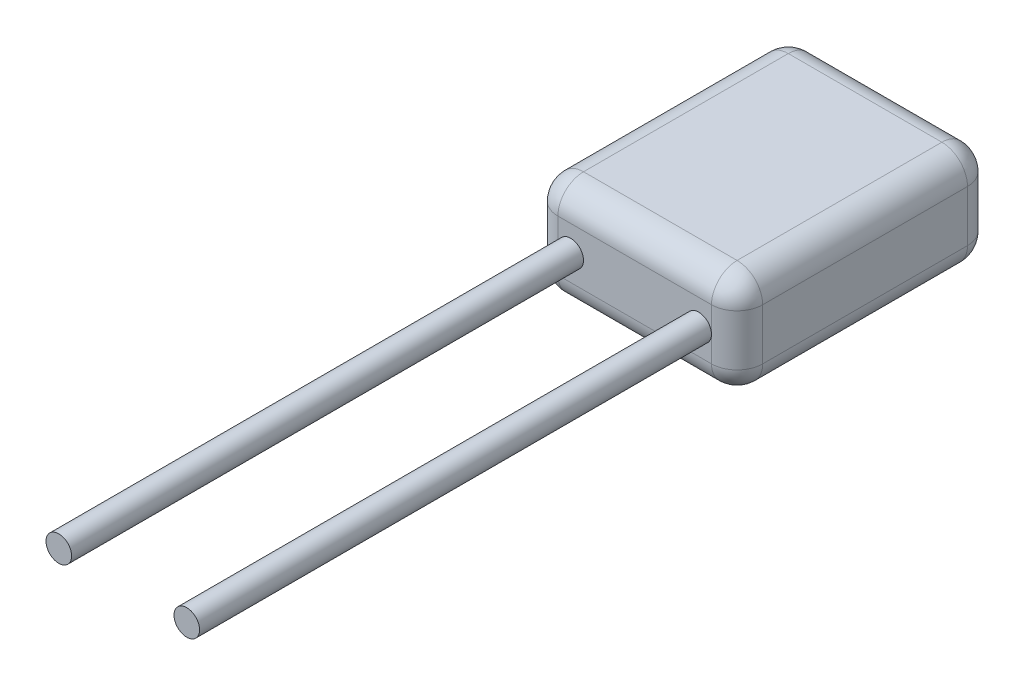
ISO-10303-21;
HEADER;
FILE_DESCRIPTION(('STEP AP214'),'2;1');
FILE_NAME('part.step','',(''),(''),'','','');
FILE_SCHEMA(('AUTOMOTIVE_DESIGN { 1 0 10303 214 1 1 1 1 }'));
ENDSEC;
DATA;
#1=APPLICATION_CONTEXT('core data for automotive mechanical design processes');
#2=APPLICATION_PROTOCOL_DEFINITION('international standard','automotive_design',2000,#1);
#3=PRODUCT_CONTEXT('',#1,'mechanical');
#4=PRODUCT('Part','Part','',(#3));
#5=PRODUCT_RELATED_PRODUCT_CATEGORY('part','',(#4));
#6=PRODUCT_DEFINITION_FORMATION('','',#4);
#7=PRODUCT_DEFINITION_CONTEXT('part definition',#1,'design');
#8=PRODUCT_DEFINITION('design','',#6,#7);
#9=PRODUCT_DEFINITION_SHAPE('','',#8);
#10=(LENGTH_UNIT() NAMED_UNIT(*) SI_UNIT(.MILLI.,.METRE.));
#11=(NAMED_UNIT(*) PLANE_ANGLE_UNIT() SI_UNIT($,.RADIAN.));
#12=(NAMED_UNIT(*) SI_UNIT($,.STERADIAN.) SOLID_ANGLE_UNIT());
#13=UNCERTAINTY_MEASURE_WITH_UNIT(LENGTH_MEASURE(1.E-05),#10,'distance_accuracy_value','');
#14=(GEOMETRIC_REPRESENTATION_CONTEXT(3) GLOBAL_UNCERTAINTY_ASSIGNED_CONTEXT((#13)) GLOBAL_UNIT_ASSIGNED_CONTEXT((#10,
#11,#12)) REPRESENTATION_CONTEXT('',''));
#15=CARTESIAN_POINT('',(0.,0.,0.));
#16=DIRECTION('',(0.,0.,1.));
#17=DIRECTION('',(1.,0.,0.));
#18=AXIS2_PLACEMENT_3D('',#15,#16,#17);
#19=CARTESIAN_POINT('',(2.,-1.,5.));
#20=DIRECTION('',(-1.,0.,0.));
#21=DIRECTION('',(0.,0.,1.));
#22=AXIS2_PLACEMENT_3D('',#19,#20,#21);
#23=PLANE('',#22);
#24=DIRECTION('',(0.,0.,-1.));
#25=VECTOR('',#24,1.);
#26=CARTESIAN_POINT('',(2.,0.5,5.));
#27=LINE('',#26,#25);
#28=CARTESIAN_POINT('',(2.,0.5,0.5));
#29=VERTEX_POINT('',#28);
#30=CARTESIAN_POINT('',(2.,0.5,4.5));
#31=VERTEX_POINT('',#30);
#32=EDGE_CURVE('E167',#29,#31,#27,.F.);
#33=ORIENTED_EDGE('',*,*,#32,.T.);
#34=DIRECTION('',(0.,1.,0.));
#35=VECTOR('',#34,1.);
#36=CARTESIAN_POINT('',(2.,-1.,4.5));
#37=LINE('',#36,#35);
#38=CARTESIAN_POINT('',(2.,-0.5,4.5));
#39=VERTEX_POINT('',#38);
#40=EDGE_CURVE('E171',#31,#39,#37,.F.);
#41=ORIENTED_EDGE('',*,*,#40,.T.);
#42=DIRECTION('',(0.,0.,-1.));
#43=VECTOR('',#42,1.);
#44=CARTESIAN_POINT('',(2.,-0.5,5.));
#45=LINE('',#44,#43);
#46=CARTESIAN_POINT('',(2.,-0.5,0.5));
#47=VERTEX_POINT('',#46);
#48=EDGE_CURVE('E169',#39,#47,#45,.T.);
#49=ORIENTED_EDGE('',*,*,#48,.T.);
#50=DIRECTION('',(0.,1.,0.));
#51=VECTOR('',#50,1.);
#52=CARTESIAN_POINT('',(2.,1.,0.5));
#53=LINE('',#52,#51);
#54=EDGE_CURVE('E165',#47,#29,#53,.T.);
#55=ORIENTED_EDGE('',*,*,#54,.T.);
#56=EDGE_LOOP('',(#33,#41,#49,#55));
#57=FACE_BOUND('',#56,.T.);
#58=ADVANCED_FACE('F36',(#57),#23,.F.);
#59=CARTESIAN_POINT('',(-2.,1.,5.));
#60=DIRECTION('',(0.,-1.,0.));
#61=DIRECTION('',(0.,0.,-1.));
#62=AXIS2_PLACEMENT_3D('',#59,#60,#61);
#63=PLANE('',#62);
#64=DIRECTION('',(-1.,0.,0.));
#65=VECTOR('',#64,1.);
#66=CARTESIAN_POINT('',(-2.,1.,4.5));
#67=LINE('',#66,#65);
#68=CARTESIAN_POINT('',(-1.5,1.,4.5));
#69=VERTEX_POINT('',#68);
#70=CARTESIAN_POINT('',(1.5,1.,4.5));
#71=VERTEX_POINT('',#70);
#72=EDGE_CURVE('E196',#69,#71,#67,.F.);
#73=ORIENTED_EDGE('',*,*,#72,.T.);
#74=DIRECTION('',(0.,0.,-1.));
#75=VECTOR('',#74,1.);
#76=CARTESIAN_POINT('',(1.5,1.,5.));
#77=LINE('',#76,#75);
#78=CARTESIAN_POINT('',(1.5,1.,0.5));
#79=VERTEX_POINT('',#78);
#80=EDGE_CURVE('E198',#71,#79,#77,.T.);
#81=ORIENTED_EDGE('',*,*,#80,.T.);
#82=DIRECTION('',(-1.,0.,0.));
#83=VECTOR('',#82,1.);
#84=CARTESIAN_POINT('',(-2.,1.,0.5));
#85=LINE('',#84,#83);
#86=CARTESIAN_POINT('',(-1.5,1.,0.5));
#87=VERTEX_POINT('',#86);
#88=EDGE_CURVE('E192',#79,#87,#85,.T.);
#89=ORIENTED_EDGE('',*,*,#88,.T.);
#90=DIRECTION('',(0.,0.,-1.));
#91=VECTOR('',#90,1.);
#92=CARTESIAN_POINT('',(-1.5,1.,5.));
#93=LINE('',#92,#91);
#94=EDGE_CURVE('E194',#87,#69,#93,.F.);
#95=ORIENTED_EDGE('',*,*,#94,.T.);
#96=EDGE_LOOP('',(#73,#81,#89,#95));
#97=FACE_BOUND('',#96,.T.);
#98=ADVANCED_FACE('F360',(#97),#63,.F.);
#99=CARTESIAN_POINT('',(-2.,-1.,5.));
#100=DIRECTION('',(1.,0.,0.));
#101=DIRECTION('',(0.,0.,-1.));
#102=AXIS2_PLACEMENT_3D('',#99,#100,#101);
#103=PLANE('',#102);
#104=DIRECTION('',(0.,0.,-1.));
#105=VECTOR('',#104,1.);
#106=CARTESIAN_POINT('',(-2.,-0.5,5.));
#107=LINE('',#106,#105);
#108=CARTESIAN_POINT('',(-2.,-0.5,0.5));
#109=VERTEX_POINT('',#108);
#110=CARTESIAN_POINT('',(-2.,-0.5,4.5));
#111=VERTEX_POINT('',#110);
#112=EDGE_CURVE('E178',#109,#111,#107,.F.);
#113=ORIENTED_EDGE('',*,*,#112,.T.);
#114=DIRECTION('',(0.,-1.,0.));
#115=VECTOR('',#114,1.);
#116=CARTESIAN_POINT('',(-2.,-1.,4.5));
#117=LINE('',#116,#115);
#118=CARTESIAN_POINT('',(-2.,0.5,4.5));
#119=VERTEX_POINT('',#118);
#120=EDGE_CURVE('E180',#111,#119,#117,.F.);
#121=ORIENTED_EDGE('',*,*,#120,.T.);
#122=DIRECTION('',(0.,0.,-1.));
#123=VECTOR('',#122,1.);
#124=CARTESIAN_POINT('',(-2.,0.5,5.));
#125=LINE('',#124,#123);
#126=CARTESIAN_POINT('',(-2.,0.5,0.5));
#127=VERTEX_POINT('',#126);
#128=EDGE_CURVE('E176',#119,#127,#125,.T.);
#129=ORIENTED_EDGE('',*,*,#128,.T.);
#130=DIRECTION('',(0.,-1.,0.));
#131=VECTOR('',#130,1.);
#132=CARTESIAN_POINT('',(-2.,-1.,0.5));
#133=LINE('',#132,#131);
#134=EDGE_CURVE('E174',#127,#109,#133,.T.);
#135=ORIENTED_EDGE('',*,*,#134,.T.);
#136=EDGE_LOOP('',(#113,#121,#129,#135));
#137=FACE_BOUND('',#136,.T.);
#138=ADVANCED_FACE('F326',(#137),#103,.F.);
#139=CARTESIAN_POINT('',(-2.,-1.,5.));
#140=DIRECTION('',(0.,1.,0.));
#141=DIRECTION('',(0.,0.,1.));
#142=AXIS2_PLACEMENT_3D('',#139,#140,#141);
#143=PLANE('',#142);
#144=DIRECTION('',(1.,0.,0.));
#145=VECTOR('',#144,1.);
#146=CARTESIAN_POINT('',(-2.,-1.,4.5));
#147=LINE('',#146,#145);
#148=CARTESIAN_POINT('',(1.5,-1.,4.5));
#149=VERTEX_POINT('',#148);
#150=CARTESIAN_POINT('',(-1.5,-1.,4.5));
#151=VERTEX_POINT('',#150);
#152=EDGE_CURVE('E187',#149,#151,#147,.F.);
#153=ORIENTED_EDGE('',*,*,#152,.T.);
#154=DIRECTION('',(0.,0.,-1.));
#155=VECTOR('',#154,1.);
#156=CARTESIAN_POINT('',(-1.5,-1.,5.));
#157=LINE('',#156,#155);
#158=CARTESIAN_POINT('',(-1.5,-1.,0.5));
#159=VERTEX_POINT('',#158);
#160=EDGE_CURVE('E189',#151,#159,#157,.T.);
#161=ORIENTED_EDGE('',*,*,#160,.T.);
#162=DIRECTION('',(1.,0.,0.));
#163=VECTOR('',#162,1.);
#164=CARTESIAN_POINT('',(2.,-1.,0.5));
#165=LINE('',#164,#163);
#166=CARTESIAN_POINT('',(1.5,-1.,0.5));
#167=VERTEX_POINT('',#166);
#168=EDGE_CURVE('E183',#159,#167,#165,.T.);
#169=ORIENTED_EDGE('',*,*,#168,.T.);
#170=DIRECTION('',(0.,0.,-1.));
#171=VECTOR('',#170,1.);
#172=CARTESIAN_POINT('',(1.5,-1.,5.));
#173=LINE('',#172,#171);
#174=EDGE_CURVE('E185',#167,#149,#173,.F.);
#175=ORIENTED_EDGE('',*,*,#174,.T.);
#176=EDGE_LOOP('',(#153,#161,#169,#175));
#177=FACE_BOUND('',#176,.T.);
#178=ADVANCED_FACE('F332',(#177),#143,.F.);
#179=CARTESIAN_POINT('',(0.,0.,5.));
#180=DIRECTION('',(0.,0.,-1.));
#181=DIRECTION('',(-1.,0.,0.));
#182=AXIS2_PLACEMENT_3D('',#179,#180,#181);
#183=PLANE('',#182);
#184=CARTESIAN_POINT('',(-1.25,0.,5.));
#185=DIRECTION('',(0.,0.,-1.));
#186=DIRECTION('',(-1.,0.,0.));
#187=AXIS2_PLACEMENT_3D('',#184,#185,#186);
#188=CIRCLE('',#187,0.25);
#189=CARTESIAN_POINT('',(-1.5,0.,5.));
#190=VERTEX_POINT('',#189);
#191=EDGE_CURVE('E153',#190,#190,#188,.F.);
#192=ORIENTED_EDGE('',*,*,#191,.F.);
#193=DIRECTION('',(0.,-1.,0.));
#194=VECTOR('',#193,1.);
#195=CARTESIAN_POINT('',(-1.5,0.,5.));
#196=LINE('',#195,#194);
#197=CARTESIAN_POINT('',(-1.5,-0.5,5.));
#198=VERTEX_POINT('',#197);
#199=EDGE_CURVE('E163',#190,#198,#196,.T.);
#200=ORIENTED_EDGE('',*,*,#199,.T.);
#201=DIRECTION('',(1.,0.,0.));
#202=VECTOR('',#201,1.);
#203=CARTESIAN_POINT('',(0.,-0.5,5.));
#204=LINE('',#203,#202);
#205=CARTESIAN_POINT('',(1.5,-0.5,5.));
#206=VERTEX_POINT('',#205);
#207=EDGE_CURVE('E147',#198,#206,#204,.T.);
#208=ORIENTED_EDGE('',*,*,#207,.T.);
#209=DIRECTION('',(0.,1.,0.));
#210=VECTOR('',#209,1.);
#211=CARTESIAN_POINT('',(1.5,0.,5.));
#212=LINE('',#211,#210);
#213=CARTESIAN_POINT('',(1.5,0.,5.));
#214=VERTEX_POINT('',#213);
#215=EDGE_CURVE('E133',#206,#214,#212,.T.);
#216=ORIENTED_EDGE('',*,*,#215,.T.);
#217=CARTESIAN_POINT('',(1.25,0.,5.));
#218=DIRECTION('',(0.,0.,-1.));
#219=DIRECTION('',(-1.,0.,0.));
#220=AXIS2_PLACEMENT_3D('',#217,#218,#219);
#221=CIRCLE('',#220,0.25);
#222=EDGE_CURVE('E145',#214,#214,#221,.F.);
#223=ORIENTED_EDGE('',*,*,#222,.F.);
#224=DIRECTION('',(0.,1.,0.));
#225=VECTOR('',#224,1.);
#226=CARTESIAN_POINT('',(1.5,0.,5.));
#227=LINE('',#226,#225);
#228=CARTESIAN_POINT('',(1.5,0.5,5.));
#229=VERTEX_POINT('',#228);
#230=EDGE_CURVE('E130',#214,#229,#227,.T.);
#231=ORIENTED_EDGE('',*,*,#230,.T.);
#232=DIRECTION('',(-1.,0.,0.));
#233=VECTOR('',#232,1.);
#234=CARTESIAN_POINT('',(0.,0.5,5.));
#235=LINE('',#234,#233);
#236=CARTESIAN_POINT('',(-1.5,0.5,5.));
#237=VERTEX_POINT('',#236);
#238=EDGE_CURVE('E152',#229,#237,#235,.T.);
#239=ORIENTED_EDGE('',*,*,#238,.T.);
#240=DIRECTION('',(0.,-1.,0.));
#241=VECTOR('',#240,1.);
#242=CARTESIAN_POINT('',(-1.5,0.,5.));
#243=LINE('',#242,#241);
#244=EDGE_CURVE('E140',#237,#190,#243,.T.);
#245=ORIENTED_EDGE('',*,*,#244,.T.);
#246=EDGE_LOOP('',(#192,#200,#208,#216,#223,#231,#239,#245));
#247=FACE_BOUND('',#246,.T.);
#248=ADVANCED_FACE('F144',(#247),#183,.F.);
#249=CARTESIAN_POINT('',(0.,0.,0.));
#250=DIRECTION('',(0.,0.,-1.));
#251=DIRECTION('',(-1.,0.,0.));
#252=AXIS2_PLACEMENT_3D('',#249,#250,#251);
#253=PLANE('',#252);
#254=DIRECTION('',(0.,-1.,0.));
#255=VECTOR('',#254,1.);
#256=CARTESIAN_POINT('',(-1.5,1.,0.));
#257=LINE('',#256,#255);
#258=CARTESIAN_POINT('',(-1.5,-0.5,0.));
#259=VERTEX_POINT('',#258);
#260=CARTESIAN_POINT('',(-1.5,0.5,0.));
#261=VERTEX_POINT('',#260);
#262=EDGE_CURVE('E45',#259,#261,#257,.F.);
#263=ORIENTED_EDGE('',*,*,#262,.T.);
#264=DIRECTION('',(-1.,0.,0.));
#265=VECTOR('',#264,1.);
#266=CARTESIAN_POINT('',(2.,0.5,0.));
#267=LINE('',#266,#265);
#268=CARTESIAN_POINT('',(1.5,0.5,0.));
#269=VERTEX_POINT('',#268);
#270=EDGE_CURVE('E11',#261,#269,#267,.F.);
#271=ORIENTED_EDGE('',*,*,#270,.T.);
#272=DIRECTION('',(0.,1.,0.));
#273=VECTOR('',#272,1.);
#274=CARTESIAN_POINT('',(1.5,-1.,0.));
#275=LINE('',#274,#273);
#276=CARTESIAN_POINT('',(1.5,-0.5,0.));
#277=VERTEX_POINT('',#276);
#278=EDGE_CURVE('E201',#269,#277,#275,.F.);
#279=ORIENTED_EDGE('',*,*,#278,.T.);
#280=DIRECTION('',(1.,0.,0.));
#281=VECTOR('',#280,1.);
#282=CARTESIAN_POINT('',(-2.,-0.5,0.));
#283=LINE('',#282,#281);
#284=EDGE_CURVE('E56',#277,#259,#283,.F.);
#285=ORIENTED_EDGE('',*,*,#284,.T.);
#286=EDGE_LOOP('',(#263,#271,#279,#285));
#287=FACE_BOUND('',#286,.T.);
#288=ADVANCED_FACE('F287',(#287),#253,.T.);
#289=CARTESIAN_POINT('',(-1.25,0.,15.));
#290=DIRECTION('',(0.,0.,-1.));
#291=DIRECTION('',(-1.,0.,0.));
#292=AXIS2_PLACEMENT_3D('',#289,#290,#291);
#293=CYLINDRICAL_SURFACE('',#292,0.25);
#294=CARTESIAN_POINT('',(-1.25,0.,15.));
#295=DIRECTION('',(0.,0.,1.));
#296=DIRECTION('',(1.,0.,0.));
#297=AXIS2_PLACEMENT_3D('',#294,#295,#296);
#298=CIRCLE('',#297,0.25);
#299=CARTESIAN_POINT('',(-1.,0.,15.));
#300=VERTEX_POINT('',#299);
#301=EDGE_CURVE('E157',#300,#300,#298,.T.);
#302=ORIENTED_EDGE('',*,*,#301,.F.);
#303=EDGE_LOOP('',(#302));
#304=FACE_BOUND('',#303,.T.);
#305=ORIENTED_EDGE('',*,*,#191,.T.);
#306=EDGE_LOOP('',(#305));
#307=FACE_BOUND('',#306,.T.);
#308=ADVANCED_FACE('F284',(#304,#307),#293,.T.);
#309=CARTESIAN_POINT('',(0.,0.,15.));
#310=DIRECTION('',(0.,0.,1.));
#311=DIRECTION('',(1.,0.,0.));
#312=AXIS2_PLACEMENT_3D('',#309,#310,#311);
#313=PLANE('',#312);
#314=ORIENTED_EDGE('',*,*,#301,.T.);
#315=EDGE_LOOP('',(#314));
#316=FACE_BOUND('',#315,.T.);
#317=ADVANCED_FACE('F282',(#316),#313,.T.);
#318=CARTESIAN_POINT('',(1.25,0.,15.));
#319=DIRECTION('',(0.,0.,-1.));
#320=DIRECTION('',(-1.,0.,0.));
#321=AXIS2_PLACEMENT_3D('',#318,#319,#320);
#322=CYLINDRICAL_SURFACE('',#321,0.25);
#323=CARTESIAN_POINT('',(1.25,0.,15.));
#324=DIRECTION('',(0.,0.,1.));
#325=DIRECTION('',(1.,0.,0.));
#326=AXIS2_PLACEMENT_3D('',#323,#324,#325);
#327=CIRCLE('',#326,0.25);
#328=CARTESIAN_POINT('',(1.5,0.,15.));
#329=VERTEX_POINT('',#328);
#330=EDGE_CURVE('E270',#329,#329,#327,.T.);
#331=ORIENTED_EDGE('',*,*,#330,.F.);
#332=EDGE_LOOP('',(#331));
#333=FACE_BOUND('',#332,.T.);
#334=ORIENTED_EDGE('',*,*,#222,.T.);
#335=EDGE_LOOP('',(#334));
#336=FACE_BOUND('',#335,.T.);
#337=ADVANCED_FACE('F151',(#333,#336),#322,.T.);
#338=CARTESIAN_POINT('',(0.,0.,15.));
#339=DIRECTION('',(0.,0.,1.));
#340=DIRECTION('',(1.,0.,0.));
#341=AXIS2_PLACEMENT_3D('',#338,#339,#340);
#342=PLANE('',#341);
#343=ORIENTED_EDGE('',*,*,#330,.T.);
#344=EDGE_LOOP('',(#343));
#345=FACE_BOUND('',#344,.T.);
#346=ADVANCED_FACE('F357',(#345),#342,.T.);
#347=CARTESIAN_POINT('',(-1.5,-1.,0.5));
#348=DIRECTION('',(0.,1.,0.));
#349=DIRECTION('',(0.,0.,1.));
#350=AXIS2_PLACEMENT_3D('',#347,#348,#349);
#351=CYLINDRICAL_SURFACE('',#350,0.5);
#352=CARTESIAN_POINT('',(-1.5,-0.5,0.5));
#353=DIRECTION('',(0.,-1.,0.));
#354=DIRECTION('',(0.,0.,-1.));
#355=AXIS2_PLACEMENT_3D('',#352,#353,#354);
#356=CIRCLE('',#355,0.5);
#357=EDGE_CURVE('E40',#109,#259,#356,.T.);
#358=ORIENTED_EDGE('',*,*,#357,.F.);
#359=ORIENTED_EDGE('',*,*,#134,.F.);
#360=CARTESIAN_POINT('',(-1.5,0.5,0.5));
#361=DIRECTION('',(0.,1.,0.));
#362=DIRECTION('',(0.,0.,1.));
#363=AXIS2_PLACEMENT_3D('',#360,#361,#362);
#364=CIRCLE('',#363,0.5);
#365=EDGE_CURVE('E264',#261,#127,#364,.T.);
#366=ORIENTED_EDGE('',*,*,#365,.F.);
#367=ORIENTED_EDGE('',*,*,#262,.F.);
#368=EDGE_LOOP('',(#358,#359,#366,#367));
#369=FACE_BOUND('',#368,.T.);
#370=ADVANCED_FACE('F38',(#369),#351,.T.);
#371=CARTESIAN_POINT('',(-1.5,-0.5,0.5));
#372=DIRECTION('',(0.,0.,1.));
#373=DIRECTION('',(1.,0.,0.));
#374=AXIS2_PLACEMENT_3D('',#371,#372,#373);
#375=SPHERICAL_SURFACE('',#374,0.5);
#376=CARTESIAN_POINT('',(-1.5,-0.5,0.5));
#377=DIRECTION('',(0.,0.,-1.));
#378=DIRECTION('',(-1.,0.,0.));
#379=AXIS2_PLACEMENT_3D('',#376,#377,#378);
#380=CIRCLE('',#379,0.5);
#381=EDGE_CURVE('E259',#109,#159,#380,.F.);
#382=ORIENTED_EDGE('',*,*,#381,.F.);
#383=ORIENTED_EDGE('',*,*,#357,.T.);
#384=CARTESIAN_POINT('',(-1.5,-0.5,0.5));
#385=DIRECTION('',(-1.,0.,0.));
#386=DIRECTION('',(0.,0.,1.));
#387=AXIS2_PLACEMENT_3D('',#384,#385,#386);
#388=CIRCLE('',#387,0.5);
#389=EDGE_CURVE('E262',#159,#259,#388,.F.);
#390=ORIENTED_EDGE('',*,*,#389,.F.);
#391=EDGE_LOOP('',(#382,#383,#390));
#392=FACE_BOUND('',#391,.T.);
#393=ADVANCED_FACE('F349',(#392),#375,.T.);
#394=CARTESIAN_POINT('',(-1.5,0.5,0.5));
#395=DIRECTION('',(0.,0.,1.));
#396=DIRECTION('',(1.,0.,0.));
#397=AXIS2_PLACEMENT_3D('',#394,#395,#396);
#398=SPHERICAL_SURFACE('',#397,0.5);
#399=CARTESIAN_POINT('',(-1.5,0.5,0.5));
#400=DIRECTION('',(-1.,0.,0.));
#401=DIRECTION('',(0.,0.,1.));
#402=AXIS2_PLACEMENT_3D('',#399,#400,#401);
#403=CIRCLE('',#402,0.5);
#404=EDGE_CURVE('E253',#261,#87,#403,.F.);
#405=ORIENTED_EDGE('',*,*,#404,.F.);
#406=ORIENTED_EDGE('',*,*,#365,.T.);
#407=CARTESIAN_POINT('',(-1.5,0.5,0.5));
#408=DIRECTION('',(0.,0.,-1.));
#409=DIRECTION('',(-1.,0.,0.));
#410=AXIS2_PLACEMENT_3D('',#407,#408,#409);
#411=CIRCLE('',#410,0.5);
#412=EDGE_CURVE('E256',#87,#127,#411,.F.);
#413=ORIENTED_EDGE('',*,*,#412,.F.);
#414=EDGE_LOOP('',(#405,#406,#413));
#415=FACE_BOUND('',#414,.T.);
#416=ADVANCED_FACE('F351',(#415),#398,.T.);
#417=CARTESIAN_POINT('',(-2.,-0.5,0.5));
#418=DIRECTION('',(-1.,0.,0.));
#419=DIRECTION('',(0.,0.,1.));
#420=AXIS2_PLACEMENT_3D('',#417,#418,#419);
#421=CYLINDRICAL_SURFACE('',#420,0.5);
#422=ORIENTED_EDGE('',*,*,#389,.T.);
#423=ORIENTED_EDGE('',*,*,#284,.F.);
#424=CARTESIAN_POINT('',(1.5,-0.5,0.5));
#425=DIRECTION('',(1.,0.,0.));
#426=DIRECTION('',(0.,0.,-1.));
#427=AXIS2_PLACEMENT_3D('',#424,#425,#426);
#428=CIRCLE('',#427,0.5);
#429=EDGE_CURVE('E247',#167,#277,#428,.T.);
#430=ORIENTED_EDGE('',*,*,#429,.F.);
#431=ORIENTED_EDGE('',*,*,#168,.F.);
#432=EDGE_LOOP('',(#422,#423,#430,#431));
#433=FACE_BOUND('',#432,.T.);
#434=ADVANCED_FACE('F348',(#433),#421,.T.);
#435=CARTESIAN_POINT('',(-1.5,-0.5,5.));
#436=DIRECTION('',(0.,0.,-1.));
#437=DIRECTION('',(-1.,0.,0.));
#438=AXIS2_PLACEMENT_3D('',#435,#436,#437);
#439=CYLINDRICAL_SURFACE('',#438,0.5);
#440=ORIENTED_EDGE('',*,*,#381,.T.);
#441=ORIENTED_EDGE('',*,*,#160,.F.);
#442=CARTESIAN_POINT('',(-1.5,-0.5,4.5));
#443=DIRECTION('',(0.,0.,1.));
#444=DIRECTION('',(1.,0.,0.));
#445=AXIS2_PLACEMENT_3D('',#442,#443,#444);
#446=CIRCLE('',#445,0.5);
#447=EDGE_CURVE('E244',#111,#151,#446,.T.);
#448=ORIENTED_EDGE('',*,*,#447,.F.);
#449=ORIENTED_EDGE('',*,*,#112,.F.);
#450=EDGE_LOOP('',(#440,#441,#448,#449));
#451=FACE_BOUND('',#450,.T.);
#452=ADVANCED_FACE('F329',(#451),#439,.T.);
#453=CARTESIAN_POINT('',(-1.5,0.,4.5));
#454=DIRECTION('',(0.,-1.,0.));
#455=DIRECTION('',(0.,0.,-1.));
#456=AXIS2_PLACEMENT_3D('',#453,#454,#455);
#457=CYLINDRICAL_SURFACE('',#456,0.5);
#458=CARTESIAN_POINT('',(-1.5,0.5,4.5));
#459=DIRECTION('',(0.,1.,0.));
#460=DIRECTION('',(0.,0.,1.));
#461=AXIS2_PLACEMENT_3D('',#458,#459,#460);
#462=CIRCLE('',#461,0.5);
#463=EDGE_CURVE('E238',#119,#237,#462,.T.);
#464=ORIENTED_EDGE('',*,*,#463,.F.);
#465=ORIENTED_EDGE('',*,*,#120,.F.);
#466=CARTESIAN_POINT('',(-1.5,-0.5,4.5));
#467=DIRECTION('',(0.,-1.,0.));
#468=DIRECTION('',(0.,0.,-1.));
#469=AXIS2_PLACEMENT_3D('',#466,#467,#468);
#470=CIRCLE('',#469,0.5);
#471=EDGE_CURVE('E241',#198,#111,#470,.T.);
#472=ORIENTED_EDGE('',*,*,#471,.F.);
#473=ORIENTED_EDGE('',*,*,#199,.F.);
#474=ORIENTED_EDGE('',*,*,#244,.F.);
#475=EDGE_LOOP('',(#464,#465,#472,#473,#474));
#476=FACE_BOUND('',#475,.T.);
#477=ADVANCED_FACE('F294',(#476),#457,.T.);
#478=CARTESIAN_POINT('',(-1.5,0.5,5.));
#479=DIRECTION('',(0.,0.,-1.));
#480=DIRECTION('',(-1.,0.,0.));
#481=AXIS2_PLACEMENT_3D('',#478,#479,#480);
#482=CYLINDRICAL_SURFACE('',#481,0.5);
#483=ORIENTED_EDGE('',*,*,#412,.T.);
#484=ORIENTED_EDGE('',*,*,#128,.F.);
#485=CARTESIAN_POINT('',(-1.5,0.5,4.5));
#486=DIRECTION('',(0.,0.,1.));
#487=DIRECTION('',(1.,0.,0.));
#488=AXIS2_PLACEMENT_3D('',#485,#486,#487);
#489=CIRCLE('',#488,0.5);
#490=EDGE_CURVE('E236',#69,#119,#489,.T.);
#491=ORIENTED_EDGE('',*,*,#490,.F.);
#492=ORIENTED_EDGE('',*,*,#94,.F.);
#493=EDGE_LOOP('',(#483,#484,#491,#492));
#494=FACE_BOUND('',#493,.T.);
#495=ADVANCED_FACE('F322',(#494),#482,.T.);
#496=CARTESIAN_POINT('',(-2.,0.5,0.5));
#497=DIRECTION('',(1.,0.,0.));
#498=DIRECTION('',(0.,0.,-1.));
#499=AXIS2_PLACEMENT_3D('',#496,#497,#498);
#500=CYLINDRICAL_SURFACE('',#499,0.5);
#501=ORIENTED_EDGE('',*,*,#404,.T.);
#502=ORIENTED_EDGE('',*,*,#88,.F.);
#503=CARTESIAN_POINT('',(1.5,0.5,0.5));
#504=DIRECTION('',(1.,0.,0.));
#505=DIRECTION('',(0.,0.,-1.));
#506=AXIS2_PLACEMENT_3D('',#503,#504,#505);
#507=CIRCLE('',#506,0.5);
#508=EDGE_CURVE('E233',#269,#79,#507,.T.);
#509=ORIENTED_EDGE('',*,*,#508,.F.);
#510=ORIENTED_EDGE('',*,*,#270,.F.);
#511=EDGE_LOOP('',(#501,#502,#509,#510));
#512=FACE_BOUND('',#511,.T.);
#513=ADVANCED_FACE('F397',(#512),#500,.T.);
#514=CARTESIAN_POINT('',(1.5,-1.,0.5));
#515=DIRECTION('',(0.,-1.,0.));
#516=DIRECTION('',(0.,0.,-1.));
#517=AXIS2_PLACEMENT_3D('',#514,#515,#516);
#518=CYLINDRICAL_SURFACE('',#517,0.5);
#519=CARTESIAN_POINT('',(1.5,-0.5,0.5));
#520=DIRECTION('',(0.,-1.,0.));
#521=DIRECTION('',(0.,0.,-1.));
#522=AXIS2_PLACEMENT_3D('',#519,#520,#521);
#523=CIRCLE('',#522,0.5);
#524=EDGE_CURVE('E250',#277,#47,#523,.T.);
#525=ORIENTED_EDGE('',*,*,#524,.F.);
#526=ORIENTED_EDGE('',*,*,#278,.F.);
#527=CARTESIAN_POINT('',(1.5,0.5,0.5));
#528=DIRECTION('',(0.,1.,0.));
#529=DIRECTION('',(0.,0.,1.));
#530=AXIS2_PLACEMENT_3D('',#527,#528,#529);
#531=CIRCLE('',#530,0.5);
#532=EDGE_CURVE('E231',#29,#269,#531,.T.);
#533=ORIENTED_EDGE('',*,*,#532,.F.);
#534=ORIENTED_EDGE('',*,*,#54,.F.);
#535=EDGE_LOOP('',(#525,#526,#533,#534));
#536=FACE_BOUND('',#535,.T.);
#537=ADVANCED_FACE('F342',(#536),#518,.T.);
#538=CARTESIAN_POINT('',(1.5,-0.5,0.5));
#539=DIRECTION('',(0.,0.,1.));
#540=DIRECTION('',(1.,0.,0.));
#541=AXIS2_PLACEMENT_3D('',#538,#539,#540);
#542=SPHERICAL_SURFACE('',#541,0.5);
#543=ORIENTED_EDGE('',*,*,#429,.T.);
#544=ORIENTED_EDGE('',*,*,#524,.T.);
#545=CARTESIAN_POINT('',(1.5,-0.5,0.5));
#546=DIRECTION('',(0.,0.,-1.));
#547=DIRECTION('',(-1.,0.,0.));
#548=AXIS2_PLACEMENT_3D('',#545,#546,#547);
#549=CIRCLE('',#548,0.5);
#550=EDGE_CURVE('E228',#167,#47,#549,.F.);
#551=ORIENTED_EDGE('',*,*,#550,.F.);
#552=EDGE_LOOP('',(#543,#544,#551));
#553=FACE_BOUND('',#552,.T.);
#554=ADVANCED_FACE('F346',(#553),#542,.T.);
#555=CARTESIAN_POINT('',(-1.5,-0.5,4.5));
#556=DIRECTION('',(0.,0.,1.));
#557=DIRECTION('',(1.,0.,0.));
#558=AXIS2_PLACEMENT_3D('',#555,#556,#557);
#559=SPHERICAL_SURFACE('',#558,0.5);
#560=ORIENTED_EDGE('',*,*,#471,.T.);
#561=ORIENTED_EDGE('',*,*,#447,.T.);
#562=CARTESIAN_POINT('',(-1.5,-0.5,4.5));
#563=DIRECTION('',(-1.,0.,0.));
#564=DIRECTION('',(0.,0.,1.));
#565=AXIS2_PLACEMENT_3D('',#562,#563,#564);
#566=CIRCLE('',#565,0.5);
#567=EDGE_CURVE('E225',#198,#151,#566,.F.);
#568=ORIENTED_EDGE('',*,*,#567,.F.);
#569=EDGE_LOOP('',(#560,#561,#568));
#570=FACE_BOUND('',#569,.T.);
#571=ADVANCED_FACE('F299',(#570),#559,.T.);
#572=CARTESIAN_POINT('',(-1.5,0.5,4.5));
#573=DIRECTION('',(0.,0.,1.));
#574=DIRECTION('',(1.,0.,0.));
#575=AXIS2_PLACEMENT_3D('',#572,#573,#574);
#576=SPHERICAL_SURFACE('',#575,0.5);
#577=ORIENTED_EDGE('',*,*,#490,.T.);
#578=ORIENTED_EDGE('',*,*,#463,.T.);
#579=CARTESIAN_POINT('',(-1.5,0.5,4.5));
#580=DIRECTION('',(-1.,0.,0.));
#581=DIRECTION('',(0.,0.,1.));
#582=AXIS2_PLACEMENT_3D('',#579,#580,#581);
#583=CIRCLE('',#582,0.5);
#584=EDGE_CURVE('E222',#69,#237,#583,.F.);
#585=ORIENTED_EDGE('',*,*,#584,.F.);
#586=EDGE_LOOP('',(#577,#578,#585));
#587=FACE_BOUND('',#586,.T.);
#588=ADVANCED_FACE('F318',(#587),#576,.T.);
#589=CARTESIAN_POINT('',(1.5,0.5,0.5));
#590=DIRECTION('',(0.,0.,1.));
#591=DIRECTION('',(1.,0.,0.));
#592=AXIS2_PLACEMENT_3D('',#589,#590,#591);
#593=SPHERICAL_SURFACE('',#592,0.5);
#594=ORIENTED_EDGE('',*,*,#532,.T.);
#595=ORIENTED_EDGE('',*,*,#508,.T.);
#596=CARTESIAN_POINT('',(1.5,0.5,0.5));
#597=DIRECTION('',(0.,0.,-1.));
#598=DIRECTION('',(-1.,0.,0.));
#599=AXIS2_PLACEMENT_3D('',#596,#597,#598);
#600=CIRCLE('',#599,0.5);
#601=EDGE_CURVE('E220',#29,#79,#600,.F.);
#602=ORIENTED_EDGE('',*,*,#601,.F.);
#603=EDGE_LOOP('',(#594,#595,#602));
#604=FACE_BOUND('',#603,.T.);
#605=ADVANCED_FACE('F385',(#604),#593,.T.);
#606=CARTESIAN_POINT('',(1.5,-0.5,5.));
#607=DIRECTION('',(0.,0.,-1.));
#608=DIRECTION('',(-1.,0.,0.));
#609=AXIS2_PLACEMENT_3D('',#606,#607,#608);
#610=CYLINDRICAL_SURFACE('',#609,0.5);
#611=ORIENTED_EDGE('',*,*,#550,.T.);
#612=ORIENTED_EDGE('',*,*,#48,.F.);
#613=CARTESIAN_POINT('',(1.5,-0.5,4.5));
#614=DIRECTION('',(0.,0.,1.));
#615=DIRECTION('',(1.,0.,0.));
#616=AXIS2_PLACEMENT_3D('',#613,#614,#615);
#617=CIRCLE('',#616,0.5);
#618=EDGE_CURVE('E217',#149,#39,#617,.T.);
#619=ORIENTED_EDGE('',*,*,#618,.F.);
#620=ORIENTED_EDGE('',*,*,#174,.F.);
#621=EDGE_LOOP('',(#611,#612,#619,#620));
#622=FACE_BOUND('',#621,.T.);
#623=ADVANCED_FACE('F336',(#622),#610,.T.);
#624=CARTESIAN_POINT('',(0.,-0.5,4.5));
#625=DIRECTION('',(1.,0.,0.));
#626=DIRECTION('',(0.,0.,-1.));
#627=AXIS2_PLACEMENT_3D('',#624,#625,#626);
#628=CYLINDRICAL_SURFACE('',#627,0.5);
#629=ORIENTED_EDGE('',*,*,#567,.T.);
#630=ORIENTED_EDGE('',*,*,#152,.F.);
#631=CARTESIAN_POINT('',(1.5,-0.5,4.5));
#632=DIRECTION('',(1.,0.,0.));
#633=DIRECTION('',(0.,0.,-1.));
#634=AXIS2_PLACEMENT_3D('',#631,#632,#633);
#635=CIRCLE('',#634,0.5);
#636=EDGE_CURVE('E214',#206,#149,#635,.T.);
#637=ORIENTED_EDGE('',*,*,#636,.F.);
#638=ORIENTED_EDGE('',*,*,#207,.F.);
#639=EDGE_LOOP('',(#629,#630,#637,#638));
#640=FACE_BOUND('',#639,.T.);
#641=ADVANCED_FACE('F302',(#640),#628,.T.);
#642=CARTESIAN_POINT('',(0.,0.5,4.5));
#643=DIRECTION('',(-1.,0.,0.));
#644=DIRECTION('',(0.,0.,1.));
#645=AXIS2_PLACEMENT_3D('',#642,#643,#644);
#646=CYLINDRICAL_SURFACE('',#645,0.5);
#647=ORIENTED_EDGE('',*,*,#584,.T.);
#648=ORIENTED_EDGE('',*,*,#238,.F.);
#649=CARTESIAN_POINT('',(1.5,0.5,4.5));
#650=DIRECTION('',(1.,0.,0.));
#651=DIRECTION('',(0.,0.,-1.));
#652=AXIS2_PLACEMENT_3D('',#649,#650,#651);
#653=CIRCLE('',#652,0.5);
#654=EDGE_CURVE('E211',#71,#229,#653,.T.);
#655=ORIENTED_EDGE('',*,*,#654,.F.);
#656=ORIENTED_EDGE('',*,*,#72,.F.);
#657=EDGE_LOOP('',(#647,#648,#655,#656));
#658=FACE_BOUND('',#657,.T.);
#659=ADVANCED_FACE('F315',(#658),#646,.T.);
#660=CARTESIAN_POINT('',(1.5,0.5,5.));
#661=DIRECTION('',(0.,0.,-1.));
#662=DIRECTION('',(-1.,0.,0.));
#663=AXIS2_PLACEMENT_3D('',#660,#661,#662);
#664=CYLINDRICAL_SURFACE('',#663,0.5);
#665=ORIENTED_EDGE('',*,*,#601,.T.);
#666=ORIENTED_EDGE('',*,*,#80,.F.);
#667=CARTESIAN_POINT('',(1.5,0.5,4.5));
#668=DIRECTION('',(0.,0.,1.));
#669=DIRECTION('',(1.,0.,0.));
#670=AXIS2_PLACEMENT_3D('',#667,#668,#669);
#671=CIRCLE('',#670,0.5);
#672=EDGE_CURVE('E208',#31,#71,#671,.T.);
#673=ORIENTED_EDGE('',*,*,#672,.F.);
#674=ORIENTED_EDGE('',*,*,#32,.F.);
#675=EDGE_LOOP('',(#665,#666,#673,#674));
#676=FACE_BOUND('',#675,.T.);
#677=ADVANCED_FACE('F375',(#676),#664,.T.);
#678=CARTESIAN_POINT('',(1.5,-0.5,4.5));
#679=DIRECTION('',(0.,0.,1.));
#680=DIRECTION('',(1.,0.,0.));
#681=AXIS2_PLACEMENT_3D('',#678,#679,#680);
#682=SPHERICAL_SURFACE('',#681,0.5);
#683=ORIENTED_EDGE('',*,*,#636,.T.);
#684=ORIENTED_EDGE('',*,*,#618,.T.);
#685=CARTESIAN_POINT('',(1.5,-0.5,4.5));
#686=DIRECTION('',(0.,-1.,0.));
#687=DIRECTION('',(0.,0.,-1.));
#688=AXIS2_PLACEMENT_3D('',#685,#686,#687);
#689=CIRCLE('',#688,0.5);
#690=EDGE_CURVE('E206',#206,#39,#689,.F.);
#691=ORIENTED_EDGE('',*,*,#690,.F.);
#692=EDGE_LOOP('',(#683,#684,#691));
#693=FACE_BOUND('',#692,.T.);
#694=ADVANCED_FACE('F306',(#693),#682,.T.);
#695=CARTESIAN_POINT('',(1.5,0.5,4.5));
#696=DIRECTION('',(0.,0.,1.));
#697=DIRECTION('',(1.,0.,0.));
#698=AXIS2_PLACEMENT_3D('',#695,#696,#697);
#699=SPHERICAL_SURFACE('',#698,0.5);
#700=ORIENTED_EDGE('',*,*,#672,.T.);
#701=ORIENTED_EDGE('',*,*,#654,.T.);
#702=CARTESIAN_POINT('',(1.5,0.5,4.5));
#703=DIRECTION('',(0.,1.,0.));
#704=DIRECTION('',(0.,0.,1.));
#705=AXIS2_PLACEMENT_3D('',#702,#703,#704);
#706=CIRCLE('',#705,0.5);
#707=EDGE_CURVE('E136',#31,#229,#706,.F.);
#708=ORIENTED_EDGE('',*,*,#707,.F.);
#709=EDGE_LOOP('',(#700,#701,#708));
#710=FACE_BOUND('',#709,.T.);
#711=ADVANCED_FACE('F310',(#710),#699,.T.);
#712=CARTESIAN_POINT('',(1.5,0.,4.5));
#713=DIRECTION('',(0.,1.,0.));
#714=DIRECTION('',(0.,0.,1.));
#715=AXIS2_PLACEMENT_3D('',#712,#713,#714);
#716=CYLINDRICAL_SURFACE('',#715,0.5);
#717=ORIENTED_EDGE('',*,*,#690,.T.);
#718=ORIENTED_EDGE('',*,*,#40,.F.);
#719=ORIENTED_EDGE('',*,*,#707,.T.);
#720=ORIENTED_EDGE('',*,*,#230,.F.);
#721=ORIENTED_EDGE('',*,*,#215,.F.);
#722=EDGE_LOOP('',(#717,#718,#719,#720,#721));
#723=FACE_BOUND('',#722,.T.);
#724=ADVANCED_FACE('F132',(#723),#716,.T.);
#725=CLOSED_SHELL('',(#58,#98,#138,#178,#248,#288,#308,#317,#337,#346,#370,#393,#416,#434,#452,
#477,#495,#513,#537,#554,#571,#588,#605,#623,#641,#659,#677,#694,#711,#724));
#726=MANIFOLD_SOLID_BREP('B2',#725);
#727=ADVANCED_BREP_SHAPE_REPRESENTATION('',(#18,#726),#14);
#728=SHAPE_DEFINITION_REPRESENTATION(#9,#727);
ENDSEC;
END-ISO-10303-21;
